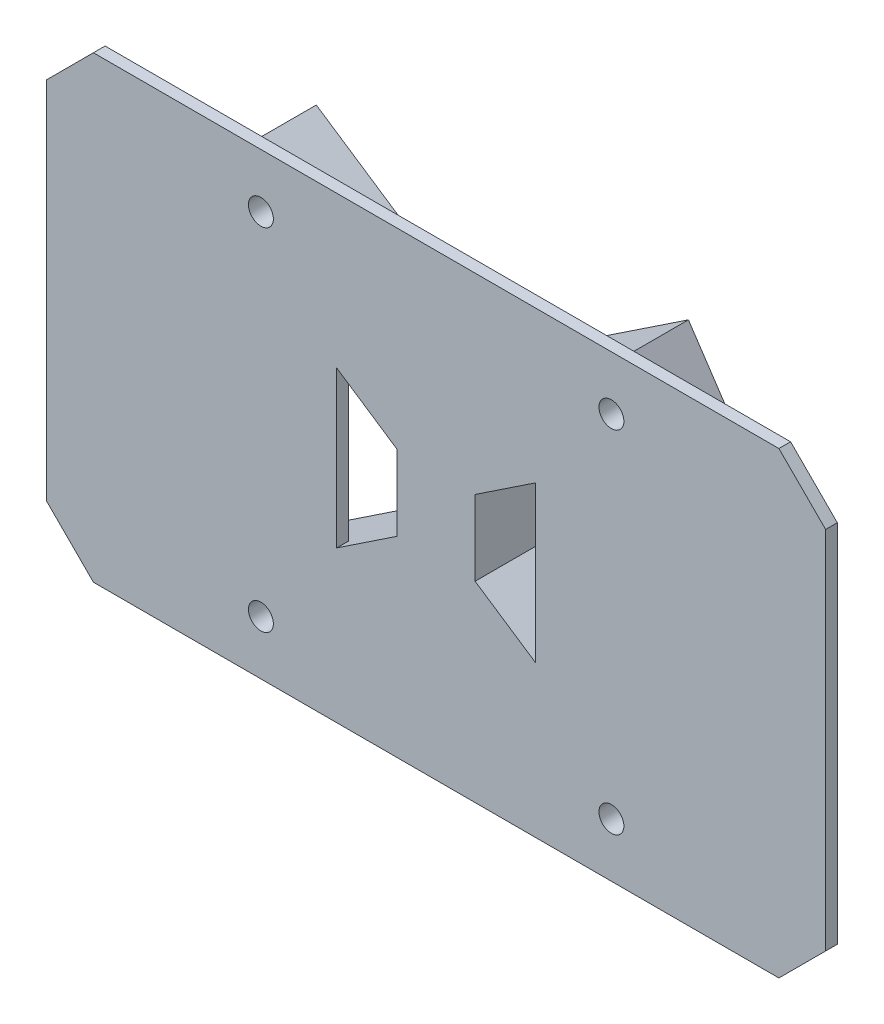
ISO-10303-21;
HEADER;
FILE_DESCRIPTION(('STEP AP214'),'2;1');
FILE_NAME('part.step','',(''),(''),'','','');
FILE_SCHEMA(('AUTOMOTIVE_DESIGN { 1 0 10303 214 1 1 1 1 }'));
ENDSEC;
DATA;
#1=APPLICATION_CONTEXT('core data for automotive mechanical design processes');
#2=APPLICATION_PROTOCOL_DEFINITION('international standard','automotive_design',2000,#1);
#3=PRODUCT_CONTEXT('',#1,'mechanical');
#4=PRODUCT('Part','Part','',(#3));
#5=PRODUCT_RELATED_PRODUCT_CATEGORY('part','',(#4));
#6=PRODUCT_DEFINITION_FORMATION('','',#4);
#7=PRODUCT_DEFINITION_CONTEXT('part definition',#1,'design');
#8=PRODUCT_DEFINITION('design','',#6,#7);
#9=PRODUCT_DEFINITION_SHAPE('','',#8);
#10=(LENGTH_UNIT() NAMED_UNIT(*) SI_UNIT(.MILLI.,.METRE.));
#11=(NAMED_UNIT(*) PLANE_ANGLE_UNIT() SI_UNIT($,.RADIAN.));
#12=(NAMED_UNIT(*) SI_UNIT($,.STERADIAN.) SOLID_ANGLE_UNIT());
#13=UNCERTAINTY_MEASURE_WITH_UNIT(LENGTH_MEASURE(1.E-05),#10,'distance_accuracy_value','');
#14=(GEOMETRIC_REPRESENTATION_CONTEXT(3) GLOBAL_UNCERTAINTY_ASSIGNED_CONTEXT((#13)) GLOBAL_UNIT_ASSIGNED_CONTEXT((#10,
#11,#12)) REPRESENTATION_CONTEXT('',''));
#15=CARTESIAN_POINT('',(0.,0.,0.));
#16=DIRECTION('',(0.,0.,1.));
#17=DIRECTION('',(1.,0.,0.));
#18=AXIS2_PLACEMENT_3D('',#15,#16,#17);
#19=CARTESIAN_POINT('',(5.,0.,7.));
#20=DIRECTION('',(1.,0.,0.));
#21=DIRECTION('',(0.,0.,-1.));
#22=AXIS2_PLACEMENT_3D('',#19,#20,#21);
#23=PLANE('',#22);
#24=DIRECTION('',(0.,-1.,0.));
#25=VECTOR('',#24,1.);
#26=CARTESIAN_POINT('',(5.,0.,0.));
#27=LINE('',#26,#25);
#28=CARTESIAN_POINT('',(5.,4.8240812075602,0.));
#29=VERTEX_POINT('',#28);
#30=CARTESIAN_POINT('',(5.,-4.82408120756012,0.));
#31=VERTEX_POINT('',#30);
#32=EDGE_CURVE('E398',#29,#31,#27,.T.);
#33=ORIENTED_EDGE('',*,*,#32,.F.);
#34=DIRECTION('',(0.,0.,-1.));
#35=VECTOR('',#34,1.);
#36=CARTESIAN_POINT('',(5.,4.8240812075602,7.));
#37=LINE('',#36,#35);
#38=CARTESIAN_POINT('',(5.,4.8240812075602,8.5));
#39=VERTEX_POINT('',#38);
#40=EDGE_CURVE('E491',#39,#29,#37,.T.);
#41=ORIENTED_EDGE('',*,*,#40,.F.);
#42=DIRECTION('',(0.,1.,0.));
#43=VECTOR('',#42,1.);
#44=CARTESIAN_POINT('',(5.,0.,8.5));
#45=LINE('',#44,#43);
#46=CARTESIAN_POINT('',(5.00000000000003,-4.82408120756007,8.5));
#47=VERTEX_POINT('',#46);
#48=EDGE_CURVE('E229',#47,#39,#45,.T.);
#49=ORIENTED_EDGE('',*,*,#48,.F.);
#50=DIRECTION('',(0.,0.,-1.));
#51=VECTOR('',#50,1.);
#52=CARTESIAN_POINT('',(5.,-4.82408120756012,7.));
#53=LINE('',#52,#51);
#54=EDGE_CURVE('E382',#47,#31,#53,.T.);
#55=ORIENTED_EDGE('',*,*,#54,.T.);
#56=EDGE_LOOP('',(#33,#41,#49,#55));
#57=FACE_BOUND('',#56,.T.);
#58=ADVANCED_FACE('F47',(#57),#23,.T.);
#59=CARTESIAN_POINT('',(-0.6880374804123,1.03205622061837,7.));
#60=DIRECTION('',(0.55470019622526,-0.832050294337823,0.));
#61=DIRECTION('',(0.832050294337823,0.55470019622526,0.));
#62=AXIS2_PLACEMENT_3D('',#59,#60,#61);
#63=PLANE('',#62);
#64=DIRECTION('',(-0.832050294337823,-0.55470019622526,0.));
#65=VECTOR('',#64,1.);
#66=CARTESIAN_POINT('',(-0.6880374804123,1.03205622061837,0.));
#67=LINE('',#66,#65);
#68=CARTESIAN_POINT('',(29.4337524528154,21.1132495094369,0.));
#69=VERTEX_POINT('',#68);
#70=EDGE_CURVE('E402',#69,#29,#67,.T.);
#71=ORIENTED_EDGE('',*,*,#70,.F.);
#72=DIRECTION('',(0.,0.,-1.));
#73=VECTOR('',#72,1.);
#74=CARTESIAN_POINT('',(29.4337524528154,21.1132495094369,7.));
#75=LINE('',#74,#73);
#76=CARTESIAN_POINT('',(29.4337524528154,21.1132495094369,7.));
#77=VERTEX_POINT('',#76);
#78=EDGE_CURVE('E488',#77,#69,#75,.T.);
#79=ORIENTED_EDGE('',*,*,#78,.F.);
#80=DIRECTION('',(-0.832050294337823,-0.55470019622526,0.));
#81=VECTOR('',#80,1.);
#82=CARTESIAN_POINT('',(-0.6880374804123,1.03205622061837,7.));
#83=LINE('',#82,#81);
#84=CARTESIAN_POINT('',(12.7638781886591,10.,7.));
#85=VERTEX_POINT('',#84);
#86=EDGE_CURVE('E239',#77,#85,#83,.T.);
#87=ORIENTED_EDGE('',*,*,#86,.T.);
#88=DIRECTION('',(0.,0.,-1.));
#89=VECTOR('',#88,1.);
#90=CARTESIAN_POINT('',(12.7638781886591,10.,8.5));
#91=LINE('',#90,#89);
#92=CARTESIAN_POINT('',(12.7638781886591,10.,8.5));
#93=VERTEX_POINT('',#92);
#94=EDGE_CURVE('E235',#93,#85,#91,.T.);
#95=ORIENTED_EDGE('',*,*,#94,.F.);
#96=DIRECTION('',(0.832050294337823,0.55470019622526,0.));
#97=VECTOR('',#96,1.);
#98=CARTESIAN_POINT('',(-0.6880374804123,1.03205622061837,8.5));
#99=LINE('',#98,#97);
#100=EDGE_CURVE('E221',#39,#93,#99,.T.);
#101=ORIENTED_EDGE('',*,*,#100,.F.);
#102=ORIENTED_EDGE('',*,*,#40,.T.);
#103=EDGE_LOOP('',(#71,#79,#87,#95,#101,#102));
#104=FACE_BOUND('',#103,.T.);
#105=ADVANCED_FACE('F237',(#104),#63,.T.);
#106=CARTESIAN_POINT('',(30.1217899332277,20.0811932888185,7.));
#107=DIRECTION('',(-0.832050294337843,-0.55470019622523,0.));
#108=DIRECTION('',(0.55470019622523,-0.832050294337843,0.));
#109=AXIS2_PLACEMENT_3D('',#106,#107,#108);
#110=PLANE('',#109);
#111=DIRECTION('',(-0.55470019622523,0.832050294337843,0.));
#112=VECTOR('',#111,1.);
#113=CARTESIAN_POINT('',(30.1217899332277,20.0811932888185,0.));
#114=LINE('',#113,#112);
#115=CARTESIAN_POINT('',(23.8867504905631,29.4337524528154,0.));
#116=VERTEX_POINT('',#115);
#117=EDGE_CURVE('E406',#69,#116,#114,.T.);
#118=ORIENTED_EDGE('',*,*,#117,.T.);
#119=DIRECTION('',(0.,0.,-1.));
#120=VECTOR('',#119,1.);
#121=CARTESIAN_POINT('',(23.8867504905631,29.4337524528154,7.));
#122=LINE('',#121,#120);
#123=CARTESIAN_POINT('',(23.886750490563,29.4337524528154,7.));
#124=VERTEX_POINT('',#123);
#125=EDGE_CURVE('E485',#124,#116,#122,.T.);
#126=ORIENTED_EDGE('',*,*,#125,.F.);
#127=DIRECTION('',(-0.55470019622523,0.832050294337843,0.));
#128=VECTOR('',#127,1.);
#129=CARTESIAN_POINT('',(30.1217899332277,20.0811932888185,7.));
#130=LINE('',#129,#128);
#131=EDGE_CURVE('E338',#77,#124,#130,.T.);
#132=ORIENTED_EDGE('',*,*,#131,.F.);
#133=ORIENTED_EDGE('',*,*,#78,.T.);
#134=EDGE_LOOP('',(#118,#126,#132,#133));
#135=FACE_BOUND('',#134,.T.);
#136=ADVANCED_FACE('F590',(#135),#110,.F.);
#137=CARTESIAN_POINT('',(-6.23503944266461,9.35255916399688,7.));
#138=DIRECTION('',(-0.55470019622523,0.832050294337843,0.));
#139=DIRECTION('',(-0.832050294337843,-0.55470019622523,0.));
#140=AXIS2_PLACEMENT_3D('',#137,#138,#139);
#141=PLANE('',#140);
#142=DIRECTION('',(0.832050294337843,0.55470019622523,0.));
#143=VECTOR('',#142,1.);
#144=CARTESIAN_POINT('',(-6.23503944266461,9.35255916399688,0.));
#145=LINE('',#144,#143);
#146=CARTESIAN_POINT('',(-1.20563281580388E-13,13.5092521257734,0.));
#147=VERTEX_POINT('',#146);
#148=EDGE_CURVE('E410',#147,#116,#145,.T.);
#149=ORIENTED_EDGE('',*,*,#148,.F.);
#150=DIRECTION('',(0.,0.,-1.));
#151=VECTOR('',#150,1.);
#152=CARTESIAN_POINT('',(-1.20563281580388E-13,13.5092521257734,7.));
#153=LINE('',#152,#151);
#154=CARTESIAN_POINT('',(-1.20563281580388E-13,13.5092521257734,7.));
#155=VERTEX_POINT('',#154);
#156=EDGE_CURVE('E482',#155,#147,#153,.T.);
#157=ORIENTED_EDGE('',*,*,#156,.F.);
#158=DIRECTION('',(0.832050294337843,0.55470019622523,0.));
#159=VECTOR('',#158,1.);
#160=CARTESIAN_POINT('',(-6.23503944266461,9.35255916399688,7.));
#161=LINE('',#160,#159);
#162=EDGE_CURVE('E342',#155,#124,#161,.T.);
#163=ORIENTED_EDGE('',*,*,#162,.T.);
#164=ORIENTED_EDGE('',*,*,#125,.T.);
#165=EDGE_LOOP('',(#149,#157,#163,#164));
#166=FACE_BOUND('',#165,.T.);
#167=ADVANCED_FACE('F886',(#166),#141,.T.);
#168=CARTESIAN_POINT('',(6.23503944266461,9.35255916399691,7.));
#169=DIRECTION('',(0.554700196225229,0.832050294337844,0.));
#170=DIRECTION('',(-0.832050294337844,0.554700196225229,0.));
#171=AXIS2_PLACEMENT_3D('',#168,#169,#170);
#172=PLANE('',#171);
#173=DIRECTION('',(0.832050294337844,-0.554700196225229,0.));
#174=VECTOR('',#173,1.);
#175=CARTESIAN_POINT('',(6.23503944266461,9.35255916399691,0.));
#176=LINE('',#175,#174);
#177=CARTESIAN_POINT('',(-23.8867504905631,29.4337524528154,0.));
#178=VERTEX_POINT('',#177);
#179=EDGE_CURVE('E414',#178,#147,#176,.T.);
#180=ORIENTED_EDGE('',*,*,#179,.F.);
#181=DIRECTION('',(0.,0.,-1.));
#182=VECTOR('',#181,1.);
#183=CARTESIAN_POINT('',(-23.8867504905631,29.4337524528154,7.));
#184=LINE('',#183,#182);
#185=CARTESIAN_POINT('',(-23.8867504905631,29.4337524528154,7.));
#186=VERTEX_POINT('',#185);
#187=EDGE_CURVE('E479',#186,#178,#184,.T.);
#188=ORIENTED_EDGE('',*,*,#187,.F.);
#189=DIRECTION('',(0.832050294337844,-0.554700196225229,0.));
#190=VECTOR('',#189,1.);
#191=CARTESIAN_POINT('',(6.23503944266461,9.35255916399691,7.));
#192=LINE('',#191,#190);
#193=EDGE_CURVE('E346',#186,#155,#192,.T.);
#194=ORIENTED_EDGE('',*,*,#193,.T.);
#195=ORIENTED_EDGE('',*,*,#156,.T.);
#196=EDGE_LOOP('',(#180,#188,#194,#195));
#197=FACE_BOUND('',#196,.T.);
#198=ADVANCED_FACE('F875',(#197),#172,.T.);
#199=CARTESIAN_POINT('',(-30.1217899332277,20.0811932888185,7.));
#200=DIRECTION('',(-0.832050294337843,0.55470019622523,0.));
#201=DIRECTION('',(-0.55470019622523,-0.832050294337843,0.));
#202=AXIS2_PLACEMENT_3D('',#199,#200,#201);
#203=PLANE('',#202);
#204=DIRECTION('',(0.55470019622523,0.832050294337843,0.));
#205=VECTOR('',#204,1.);
#206=CARTESIAN_POINT('',(-30.1217899332277,20.0811932888185,0.));
#207=LINE('',#206,#205);
#208=CARTESIAN_POINT('',(-29.4337524528154,21.1132495094369,0.));
#209=VERTEX_POINT('',#208);
#210=EDGE_CURVE('E418',#209,#178,#207,.T.);
#211=ORIENTED_EDGE('',*,*,#210,.F.);
#212=DIRECTION('',(0.,0.,-1.));
#213=VECTOR('',#212,1.);
#214=CARTESIAN_POINT('',(-29.4337524528154,21.1132495094369,7.));
#215=LINE('',#214,#213);
#216=CARTESIAN_POINT('',(-29.4337524528154,21.1132495094369,7.));
#217=VERTEX_POINT('',#216);
#218=EDGE_CURVE('E476',#217,#209,#215,.T.);
#219=ORIENTED_EDGE('',*,*,#218,.F.);
#220=DIRECTION('',(0.55470019622523,0.832050294337843,0.));
#221=VECTOR('',#220,1.);
#222=CARTESIAN_POINT('',(-30.1217899332277,20.0811932888185,7.));
#223=LINE('',#222,#221);
#224=EDGE_CURVE('E350',#217,#186,#223,.T.);
#225=ORIENTED_EDGE('',*,*,#224,.T.);
#226=ORIENTED_EDGE('',*,*,#187,.T.);
#227=EDGE_LOOP('',(#211,#219,#225,#226));
#228=FACE_BOUND('',#227,.T.);
#229=ADVANCED_FACE('F866',(#228),#203,.T.);
#230=CARTESIAN_POINT('',(0.688037480412318,1.03205622061848,7.));
#231=DIRECTION('',(-0.554700196225229,-0.832050294337844,0.));
#232=DIRECTION('',(0.832050294337844,-0.554700196225229,0.));
#233=AXIS2_PLACEMENT_3D('',#230,#231,#232);
#234=PLANE('',#233);
#235=DIRECTION('',(-0.832050294337844,0.554700196225229,0.));
#236=VECTOR('',#235,1.);
#237=CARTESIAN_POINT('',(0.688037480412318,1.03205622061848,0.));
#238=LINE('',#237,#236);
#239=CARTESIAN_POINT('',(-5.,4.82408120756002,0.));
#240=VERTEX_POINT('',#239);
#241=EDGE_CURVE('E422',#240,#209,#238,.T.);
#242=ORIENTED_EDGE('',*,*,#241,.F.);
#243=DIRECTION('',(0.,0.,-1.));
#244=VECTOR('',#243,1.);
#245=CARTESIAN_POINT('',(-5.,4.82408120756002,7.));
#246=LINE('',#245,#244);
#247=CARTESIAN_POINT('',(-5.,4.82408120756002,8.5));
#248=VERTEX_POINT('',#247);
#249=EDGE_CURVE('E473',#248,#240,#246,.T.);
#250=ORIENTED_EDGE('',*,*,#249,.F.);
#251=DIRECTION('',(0.832050294337844,-0.554700196225229,0.));
#252=VECTOR('',#251,1.);
#253=CARTESIAN_POINT('',(0.688037480412319,1.03205622061848,8.5));
#254=LINE('',#253,#252);
#255=CARTESIAN_POINT('',(-12.7638781886598,9.99999999999986,8.5));
#256=VERTEX_POINT('',#255);
#257=EDGE_CURVE('E262',#256,#248,#254,.T.);
#258=ORIENTED_EDGE('',*,*,#257,.F.);
#259=DIRECTION('',(0.,0.,-1.));
#260=VECTOR('',#259,1.);
#261=CARTESIAN_POINT('',(-12.7638781886598,9.99999999999986,8.5));
#262=LINE('',#261,#260);
#263=CARTESIAN_POINT('',(-12.7638781886598,9.99999999999986,7.));
#264=VERTEX_POINT('',#263);
#265=EDGE_CURVE('E329',#256,#264,#262,.T.);
#266=ORIENTED_EDGE('',*,*,#265,.T.);
#267=DIRECTION('',(-0.832050294337844,0.554700196225229,0.));
#268=VECTOR('',#267,1.);
#269=CARTESIAN_POINT('',(0.688037480412318,1.03205622061848,7.));
#270=LINE('',#269,#268);
#271=EDGE_CURVE('E354',#264,#217,#270,.T.);
#272=ORIENTED_EDGE('',*,*,#271,.T.);
#273=ORIENTED_EDGE('',*,*,#218,.T.);
#274=EDGE_LOOP('',(#242,#250,#258,#266,#272,#273));
#275=FACE_BOUND('',#274,.T.);
#276=ADVANCED_FACE('F855',(#275),#234,.T.);
#277=CARTESIAN_POINT('',(-5.00000000000001,0.,7.));
#278=DIRECTION('',(1.,0.,0.));
#279=DIRECTION('',(0.,1.,0.));
#280=AXIS2_PLACEMENT_3D('',#277,#278,#279);
#281=PLANE('',#280);
#282=DIRECTION('',(0.,-1.,0.));
#283=VECTOR('',#282,1.);
#284=CARTESIAN_POINT('',(-5.00000000000001,0.,0.));
#285=LINE('',#284,#283);
#286=CARTESIAN_POINT('',(-5.00000000000001,-4.82408120756004,0.));
#287=VERTEX_POINT('',#286);
#288=EDGE_CURVE('E426',#240,#287,#285,.T.);
#289=ORIENTED_EDGE('',*,*,#288,.T.);
#290=DIRECTION('',(0.,0.,-1.));
#291=VECTOR('',#290,1.);
#292=CARTESIAN_POINT('',(-5.00000000000001,-4.82408120756004,7.));
#293=LINE('',#292,#291);
#294=CARTESIAN_POINT('',(-5.00000000000001,-4.82408120756004,8.5));
#295=VERTEX_POINT('',#294);
#296=EDGE_CURVE('E470',#295,#287,#293,.T.);
#297=ORIENTED_EDGE('',*,*,#296,.F.);
#298=DIRECTION('',(0.,-1.,0.));
#299=VECTOR('',#298,1.);
#300=CARTESIAN_POINT('',(-5.00000000000001,0.,8.5));
#301=LINE('',#300,#299);
#302=EDGE_CURVE('E266',#248,#295,#301,.T.);
#303=ORIENTED_EDGE('',*,*,#302,.F.);
#304=ORIENTED_EDGE('',*,*,#249,.T.);
#305=EDGE_LOOP('',(#289,#297,#303,#304));
#306=FACE_BOUND('',#305,.T.);
#307=ADVANCED_FACE('F846',(#306),#281,.F.);
#308=CARTESIAN_POINT('',(0.68803748041232,-1.03205622061848,7.));
#309=DIRECTION('',(-0.55470019622523,0.832050294337843,0.));
#310=DIRECTION('',(-0.832050294337843,-0.55470019622523,0.));
#311=AXIS2_PLACEMENT_3D('',#308,#309,#310);
#312=PLANE('',#311);
#313=DIRECTION('',(0.832050294337843,0.55470019622523,0.));
#314=VECTOR('',#313,1.);
#315=CARTESIAN_POINT('',(0.68803748041232,-1.03205622061848,0.));
#316=LINE('',#315,#314);
#317=CARTESIAN_POINT('',(-29.4337524528154,-21.113249509437,0.));
#318=VERTEX_POINT('',#317);
#319=EDGE_CURVE('E430',#318,#287,#316,.T.);
#320=ORIENTED_EDGE('',*,*,#319,.F.);
#321=DIRECTION('',(0.,0.,-1.));
#322=VECTOR('',#321,1.);
#323=CARTESIAN_POINT('',(-29.4337524528154,-21.113249509437,7.));
#324=LINE('',#323,#322);
#325=CARTESIAN_POINT('',(-29.4337524528154,-21.113249509437,7.));
#326=VERTEX_POINT('',#325);
#327=EDGE_CURVE('E467',#326,#318,#324,.T.);
#328=ORIENTED_EDGE('',*,*,#327,.F.);
#329=DIRECTION('',(0.832050294337843,0.55470019622523,0.));
#330=VECTOR('',#329,1.);
#331=CARTESIAN_POINT('',(0.68803748041232,-1.03205622061848,7.));
#332=LINE('',#331,#330);
#333=CARTESIAN_POINT('',(-12.7638781886599,-10.,7.));
#334=VERTEX_POINT('',#333);
#335=EDGE_CURVE('E358',#326,#334,#332,.T.);
#336=ORIENTED_EDGE('',*,*,#335,.T.);
#337=DIRECTION('',(0.,0.,-1.));
#338=VECTOR('',#337,1.);
#339=CARTESIAN_POINT('',(-12.7638781886599,-10.,8.5));
#340=LINE('',#339,#338);
#341=CARTESIAN_POINT('',(-12.7638781886599,-10.,8.5));
#342=VERTEX_POINT('',#341);
#343=EDGE_CURVE('E244',#342,#334,#340,.T.);
#344=ORIENTED_EDGE('',*,*,#343,.F.);
#345=DIRECTION('',(-0.832050294337843,-0.55470019622523,0.));
#346=VECTOR('',#345,1.);
#347=CARTESIAN_POINT('',(0.68803748041232,-1.03205622061848,8.5));
#348=LINE('',#347,#346);
#349=EDGE_CURVE('E270',#295,#342,#348,.T.);
#350=ORIENTED_EDGE('',*,*,#349,.F.);
#351=ORIENTED_EDGE('',*,*,#296,.T.);
#352=EDGE_LOOP('',(#320,#328,#336,#344,#350,#351));
#353=FACE_BOUND('',#352,.T.);
#354=ADVANCED_FACE('F835',(#353),#312,.T.);
#355=CARTESIAN_POINT('',(-30.1217899332277,-20.0811932888185,7.));
#356=DIRECTION('',(0.832050294337843,0.55470019622523,0.));
#357=DIRECTION('',(-0.55470019622523,0.832050294337843,0.));
#358=AXIS2_PLACEMENT_3D('',#355,#356,#357);
#359=PLANE('',#358);
#360=DIRECTION('',(0.55470019622523,-0.832050294337843,0.));
#361=VECTOR('',#360,1.);
#362=CARTESIAN_POINT('',(-30.1217899332277,-20.0811932888185,0.));
#363=LINE('',#362,#361);
#364=CARTESIAN_POINT('',(-23.886750490563,-29.4337524528154,0.));
#365=VERTEX_POINT('',#364);
#366=EDGE_CURVE('E434',#318,#365,#363,.T.);
#367=ORIENTED_EDGE('',*,*,#366,.T.);
#368=DIRECTION('',(0.,0.,-1.));
#369=VECTOR('',#368,1.);
#370=CARTESIAN_POINT('',(-23.886750490563,-29.4337524528154,7.));
#371=LINE('',#370,#369);
#372=CARTESIAN_POINT('',(-23.886750490563,-29.4337524528154,7.));
#373=VERTEX_POINT('',#372);
#374=EDGE_CURVE('E464',#373,#365,#371,.T.);
#375=ORIENTED_EDGE('',*,*,#374,.F.);
#376=DIRECTION('',(0.55470019622523,-0.832050294337843,0.));
#377=VECTOR('',#376,1.);
#378=CARTESIAN_POINT('',(-30.1217899332277,-20.0811932888185,7.));
#379=LINE('',#378,#377);
#380=EDGE_CURVE('E362',#326,#373,#379,.T.);
#381=ORIENTED_EDGE('',*,*,#380,.F.);
#382=ORIENTED_EDGE('',*,*,#327,.T.);
#383=EDGE_LOOP('',(#367,#375,#381,#382));
#384=FACE_BOUND('',#383,.T.);
#385=ADVANCED_FACE('F826',(#384),#359,.F.);
#386=CARTESIAN_POINT('',(6.23503944266461,-9.35255916399687,7.));
#387=DIRECTION('',(0.554700196225231,-0.832050294337843,0.));
#388=DIRECTION('',(0.832050294337843,0.554700196225231,0.));
#389=AXIS2_PLACEMENT_3D('',#386,#387,#388);
#390=PLANE('',#389);
#391=DIRECTION('',(-0.832050294337843,-0.554700196225231,0.));
#392=VECTOR('',#391,1.);
#393=CARTESIAN_POINT('',(6.23503944266461,-9.35255916399687,0.));
#394=LINE('',#393,#392);
#395=CARTESIAN_POINT('',(-1.11022302462516E-13,-13.5092521257734,0.));
#396=VERTEX_POINT('',#395);
#397=EDGE_CURVE('E438',#396,#365,#394,.T.);
#398=ORIENTED_EDGE('',*,*,#397,.F.);
#399=DIRECTION('',(0.,0.,-1.));
#400=VECTOR('',#399,1.);
#401=CARTESIAN_POINT('',(-1.11022302462516E-13,-13.5092521257734,7.));
#402=LINE('',#401,#400);
#403=CARTESIAN_POINT('',(-1.11022302462516E-13,-13.5092521257734,7.));
#404=VERTEX_POINT('',#403);
#405=EDGE_CURVE('E461',#404,#396,#402,.T.);
#406=ORIENTED_EDGE('',*,*,#405,.F.);
#407=DIRECTION('',(-0.832050294337843,-0.554700196225231,0.));
#408=VECTOR('',#407,1.);
#409=CARTESIAN_POINT('',(6.23503944266461,-9.35255916399687,7.));
#410=LINE('',#409,#408);
#411=EDGE_CURVE('E366',#404,#373,#410,.T.);
#412=ORIENTED_EDGE('',*,*,#411,.T.);
#413=ORIENTED_EDGE('',*,*,#374,.T.);
#414=EDGE_LOOP('',(#398,#406,#412,#413));
#415=FACE_BOUND('',#414,.T.);
#416=ADVANCED_FACE('F816',(#415),#390,.T.);
#417=CARTESIAN_POINT('',(-6.23503944266488,-9.35255916399653,7.));
#418=DIRECTION('',(-0.554700196225262,-0.832050294337822,0.));
#419=DIRECTION('',(0.832050294337822,-0.554700196225262,0.));
#420=AXIS2_PLACEMENT_3D('',#417,#418,#419);
#421=PLANE('',#420);
#422=DIRECTION('',(-0.832050294337822,0.554700196225262,0.));
#423=VECTOR('',#422,1.);
#424=CARTESIAN_POINT('',(-6.23503944266488,-9.35255916399653,0.));
#425=LINE('',#424,#423);
#426=CARTESIAN_POINT('',(23.8867504905631,-29.4337524528154,0.));
#427=VERTEX_POINT('',#426);
#428=EDGE_CURVE('E442',#427,#396,#425,.T.);
#429=ORIENTED_EDGE('',*,*,#428,.F.);
#430=DIRECTION('',(0.,0.,-1.));
#431=VECTOR('',#430,1.);
#432=CARTESIAN_POINT('',(23.8867504905631,-29.4337524528154,7.));
#433=LINE('',#432,#431);
#434=CARTESIAN_POINT('',(23.8867504905631,-29.4337524528154,7.));
#435=VERTEX_POINT('',#434);
#436=EDGE_CURVE('E458',#435,#427,#433,.T.);
#437=ORIENTED_EDGE('',*,*,#436,.F.);
#438=DIRECTION('',(-0.832050294337822,0.554700196225262,0.));
#439=VECTOR('',#438,1.);
#440=CARTESIAN_POINT('',(-6.23503944266488,-9.35255916399653,7.));
#441=LINE('',#440,#439);
#442=EDGE_CURVE('E370',#435,#404,#441,.T.);
#443=ORIENTED_EDGE('',*,*,#442,.T.);
#444=ORIENTED_EDGE('',*,*,#405,.T.);
#445=EDGE_LOOP('',(#429,#437,#443,#444));
#446=FACE_BOUND('',#445,.T.);
#447=ADVANCED_FACE('F805',(#446),#421,.T.);
#448=CARTESIAN_POINT('',(30.1217899332277,-20.0811932888185,7.));
#449=DIRECTION('',(0.832050294337843,-0.554700196225229,0.));
#450=DIRECTION('',(0.554700196225229,0.832050294337843,0.));
#451=AXIS2_PLACEMENT_3D('',#448,#449,#450);
#452=PLANE('',#451);
#453=DIRECTION('',(-0.554700196225229,-0.832050294337843,0.));
#454=VECTOR('',#453,1.);
#455=CARTESIAN_POINT('',(30.1217899332277,-20.0811932888185,0.));
#456=LINE('',#455,#454);
#457=CARTESIAN_POINT('',(29.4337524528154,-21.1132495094369,0.));
#458=VERTEX_POINT('',#457);
#459=EDGE_CURVE('E446',#458,#427,#456,.T.);
#460=ORIENTED_EDGE('',*,*,#459,.F.);
#461=DIRECTION('',(0.,0.,-1.));
#462=VECTOR('',#461,1.);
#463=CARTESIAN_POINT('',(29.4337524528154,-21.1132495094369,7.));
#464=LINE('',#463,#462);
#465=CARTESIAN_POINT('',(29.4337524528154,-21.1132495094369,7.));
#466=VERTEX_POINT('',#465);
#467=EDGE_CURVE('E455',#466,#458,#464,.T.);
#468=ORIENTED_EDGE('',*,*,#467,.F.);
#469=DIRECTION('',(-0.554700196225229,-0.832050294337843,0.));
#470=VECTOR('',#469,1.);
#471=CARTESIAN_POINT('',(30.1217899332277,-20.0811932888185,7.));
#472=LINE('',#471,#470);
#473=EDGE_CURVE('E374',#466,#435,#472,.T.);
#474=ORIENTED_EDGE('',*,*,#473,.T.);
#475=ORIENTED_EDGE('',*,*,#436,.T.);
#476=EDGE_LOOP('',(#460,#468,#474,#475));
#477=FACE_BOUND('',#476,.T.);
#478=ADVANCED_FACE('F599',(#477),#452,.T.);
#479=CARTESIAN_POINT('',(-22.5,22.5,7.));
#480=DIRECTION('',(0.,0.,-1.));
#481=DIRECTION('',(-1.,0.,0.));
#482=AXIS2_PLACEMENT_3D('',#479,#480,#481);
#483=CYLINDRICAL_SURFACE('',#482,1.6);
#484=CARTESIAN_POINT('',(-22.5,22.5,0.));
#485=DIRECTION('',(0.,0.,1.));
#486=DIRECTION('',(1.,0.,0.));
#487=AXIS2_PLACEMENT_3D('',#484,#485,#486);
#488=CIRCLE('',#487,1.6);
#489=CARTESIAN_POINT('',(-20.9,22.5,0.));
#490=VERTEX_POINT('',#489);
#491=EDGE_CURVE('E394',#490,#490,#488,.T.);
#492=ORIENTED_EDGE('',*,*,#491,.F.);
#493=EDGE_LOOP('',(#492));
#494=FACE_BOUND('',#493,.T.);
#495=CARTESIAN_POINT('',(-22.5,22.5,8.5));
#496=DIRECTION('',(0.,0.,1.));
#497=DIRECTION('',(1.,0.,0.));
#498=AXIS2_PLACEMENT_3D('',#495,#496,#497);
#499=CIRCLE('',#498,1.6);
#500=CARTESIAN_POINT('',(-20.9,22.5,8.5));
#501=VERTEX_POINT('',#500);
#502=EDGE_CURVE('E300',#501,#501,#499,.F.);
#503=ORIENTED_EDGE('',*,*,#502,.F.);
#504=EDGE_LOOP('',(#503));
#505=FACE_BOUND('',#504,.T.);
#506=ADVANCED_FACE('F595',(#494,#505),#483,.F.);
#507=CARTESIAN_POINT('',(22.5,22.5000000000013,7.));
#508=DIRECTION('',(0.,0.,-1.));
#509=DIRECTION('',(-1.,0.,0.));
#510=AXIS2_PLACEMENT_3D('',#507,#508,#509);
#511=CYLINDRICAL_SURFACE('',#510,1.60000000000132);
#512=CARTESIAN_POINT('',(22.5,22.5000000000013,0.));
#513=DIRECTION('',(0.,0.,1.));
#514=DIRECTION('',(1.,0.,0.));
#515=AXIS2_PLACEMENT_3D('',#512,#513,#514);
#516=CIRCLE('',#515,1.60000000000132);
#517=CARTESIAN_POINT('',(24.1000000000013,22.5000000000013,0.));
#518=VERTEX_POINT('',#517);
#519=EDGE_CURVE('E390',#518,#518,#516,.T.);
#520=ORIENTED_EDGE('',*,*,#519,.F.);
#521=EDGE_LOOP('',(#520));
#522=FACE_BOUND('',#521,.T.);
#523=CARTESIAN_POINT('',(22.5,22.5000000000013,8.5));
#524=DIRECTION('',(0.,0.,1.));
#525=DIRECTION('',(1.,0.,0.));
#526=AXIS2_PLACEMENT_3D('',#523,#524,#525);
#527=CIRCLE('',#526,1.60000000000132);
#528=CARTESIAN_POINT('',(24.1000000000013,22.5000000000013,8.5));
#529=VERTEX_POINT('',#528);
#530=EDGE_CURVE('E296',#529,#529,#527,.F.);
#531=ORIENTED_EDGE('',*,*,#530,.F.);
#532=EDGE_LOOP('',(#531));
#533=FACE_BOUND('',#532,.T.);
#534=ADVANCED_FACE('F598',(#522,#533),#511,.F.);
#535=CARTESIAN_POINT('',(22.5000000000013,-22.4999999999987,7.));
#536=DIRECTION('',(0.,0.,-1.));
#537=DIRECTION('',(-1.,0.,0.));
#538=AXIS2_PLACEMENT_3D('',#535,#536,#537);
#539=CYLINDRICAL_SURFACE('',#538,1.6000000000018);
#540=CARTESIAN_POINT('',(22.5000000000013,-22.4999999999987,0.));
#541=DIRECTION('',(0.,0.,1.));
#542=DIRECTION('',(1.,0.,0.));
#543=AXIS2_PLACEMENT_3D('',#540,#541,#542);
#544=CIRCLE('',#543,1.6000000000018);
#545=CARTESIAN_POINT('',(24.1000000000031,-22.4999999999987,0.));
#546=VERTEX_POINT('',#545);
#547=EDGE_CURVE('E386',#546,#546,#544,.T.);
#548=ORIENTED_EDGE('',*,*,#547,.F.);
#549=EDGE_LOOP('',(#548));
#550=FACE_BOUND('',#549,.T.);
#551=CARTESIAN_POINT('',(22.5000000000013,-22.4999999999987,8.5));
#552=DIRECTION('',(0.,0.,1.));
#553=DIRECTION('',(1.,0.,0.));
#554=AXIS2_PLACEMENT_3D('',#551,#552,#553);
#555=CIRCLE('',#554,1.6000000000018);
#556=CARTESIAN_POINT('',(24.1000000000031,-22.4999999999987,8.5));
#557=VERTEX_POINT('',#556);
#558=EDGE_CURVE('E288',#557,#557,#555,.F.);
#559=ORIENTED_EDGE('',*,*,#558,.F.);
#560=EDGE_LOOP('',(#559));
#561=FACE_BOUND('',#560,.T.);
#562=ADVANCED_FACE('F603',(#550,#561),#539,.F.);
#563=CARTESIAN_POINT('',(-22.4999999999987,-22.5,7.));
#564=DIRECTION('',(0.,0.,-1.));
#565=DIRECTION('',(-1.,0.,0.));
#566=AXIS2_PLACEMENT_3D('',#563,#564,#565);
#567=CYLINDRICAL_SURFACE('',#566,1.60000000000068);
#568=CARTESIAN_POINT('',(-22.4999999999987,-22.5,0.));
#569=DIRECTION('',(0.,0.,1.));
#570=DIRECTION('',(1.,0.,0.));
#571=AXIS2_PLACEMENT_3D('',#568,#569,#570);
#572=CIRCLE('',#571,1.60000000000068);
#573=CARTESIAN_POINT('',(-20.8999999999981,-22.5,0.));
#574=VERTEX_POINT('',#573);
#575=EDGE_CURVE('E333',#574,#574,#572,.T.);
#576=ORIENTED_EDGE('',*,*,#575,.F.);
#577=EDGE_LOOP('',(#576));
#578=FACE_BOUND('',#577,.T.);
#579=CARTESIAN_POINT('',(-22.4999999999987,-22.5,8.5));
#580=DIRECTION('',(0.,0.,1.));
#581=DIRECTION('',(1.,0.,0.));
#582=AXIS2_PLACEMENT_3D('',#579,#580,#581);
#583=CIRCLE('',#582,1.60000000000068);
#584=CARTESIAN_POINT('',(-20.8999999999981,-22.5,8.5));
#585=VERTEX_POINT('',#584);
#586=EDGE_CURVE('E292',#585,#585,#583,.F.);
#587=ORIENTED_EDGE('',*,*,#586,.F.);
#588=EDGE_LOOP('',(#587));
#589=FACE_BOUND('',#588,.T.);
#590=ADVANCED_FACE('F607',(#578,#589),#567,.F.);
#591=CARTESIAN_POINT('',(-0.688037480412335,-1.0320562206185,7.));
#592=DIRECTION('',(0.554700196225228,0.832050294337844,0.));
#593=DIRECTION('',(-0.832050294337844,0.554700196225228,0.));
#594=AXIS2_PLACEMENT_3D('',#591,#592,#593);
#595=PLANE('',#594);
#596=DIRECTION('',(0.832050294337844,-0.554700196225228,0.));
#597=VECTOR('',#596,1.);
#598=CARTESIAN_POINT('',(-0.688037480412335,-1.0320562206185,0.));
#599=LINE('',#598,#597);
#600=EDGE_CURVE('E339',#31,#458,#599,.T.);
#601=ORIENTED_EDGE('',*,*,#600,.F.);
#602=ORIENTED_EDGE('',*,*,#54,.F.);
#603=DIRECTION('',(-0.832050294337844,0.554700196225228,0.));
#604=VECTOR('',#603,1.);
#605=CARTESIAN_POINT('',(-0.688037480412335,-1.0320562206185,8.5));
#606=LINE('',#605,#604);
#607=CARTESIAN_POINT('',(12.7638781886599,-10.,8.5));
#608=VERTEX_POINT('',#607);
#609=EDGE_CURVE('E251',#608,#47,#606,.T.);
#610=ORIENTED_EDGE('',*,*,#609,.F.);
#611=DIRECTION('',(0.,0.,-1.));
#612=VECTOR('',#611,1.);
#613=CARTESIAN_POINT('',(12.7638781886599,-10.,8.5));
#614=LINE('',#613,#612);
#615=CARTESIAN_POINT('',(12.7638781886599,-10.,7.));
#616=VERTEX_POINT('',#615);
#617=EDGE_CURVE('E245',#608,#616,#614,.T.);
#618=ORIENTED_EDGE('',*,*,#617,.T.);
#619=DIRECTION('',(0.832050294337844,-0.554700196225228,0.));
#620=VECTOR('',#619,1.);
#621=CARTESIAN_POINT('',(-0.688037480412335,-1.0320562206185,7.));
#622=LINE('',#621,#620);
#623=EDGE_CURVE('E378',#616,#466,#622,.T.);
#624=ORIENTED_EDGE('',*,*,#623,.T.);
#625=ORIENTED_EDGE('',*,*,#467,.T.);
#626=EDGE_LOOP('',(#601,#602,#610,#618,#624,#625));
#627=FACE_BOUND('',#626,.T.);
#628=ADVANCED_FACE('F611',(#627),#595,.T.);
#629=CARTESIAN_POINT('',(0.,0.,0.));
#630=DIRECTION('',(0.,0.,1.));
#631=DIRECTION('',(1.,0.,0.));
#632=AXIS2_PLACEMENT_3D('',#629,#630,#631);
#633=PLANE('',#632);
#634=ORIENTED_EDGE('',*,*,#575,.T.);
#635=EDGE_LOOP('',(#634));
#636=FACE_BOUND('',#635,.T.);
#637=ORIENTED_EDGE('',*,*,#547,.T.);
#638=EDGE_LOOP('',(#637));
#639=FACE_BOUND('',#638,.T.);
#640=ORIENTED_EDGE('',*,*,#519,.T.);
#641=EDGE_LOOP('',(#640));
#642=FACE_BOUND('',#641,.T.);
#643=ORIENTED_EDGE('',*,*,#491,.T.);
#644=EDGE_LOOP('',(#643));
#645=FACE_BOUND('',#644,.T.);
#646=ORIENTED_EDGE('',*,*,#32,.T.);
#647=ORIENTED_EDGE('',*,*,#600,.T.);
#648=ORIENTED_EDGE('',*,*,#459,.T.);
#649=ORIENTED_EDGE('',*,*,#428,.T.);
#650=ORIENTED_EDGE('',*,*,#397,.T.);
#651=ORIENTED_EDGE('',*,*,#366,.F.);
#652=ORIENTED_EDGE('',*,*,#319,.T.);
#653=ORIENTED_EDGE('',*,*,#288,.F.);
#654=ORIENTED_EDGE('',*,*,#241,.T.);
#655=ORIENTED_EDGE('',*,*,#210,.T.);
#656=ORIENTED_EDGE('',*,*,#179,.T.);
#657=ORIENTED_EDGE('',*,*,#148,.T.);
#658=ORIENTED_EDGE('',*,*,#117,.F.);
#659=ORIENTED_EDGE('',*,*,#70,.T.);
#660=EDGE_LOOP('',(#646,#647,#648,#649,#650,#651,#652,#653,#654,#655,#656,#657,#658,#659));
#661=FACE_BOUND('',#660,.T.);
#662=ADVANCED_FACE('F752',(#636,#639,#642,#645,#661),#633,.F.);
#663=CARTESIAN_POINT('',(0.,0.,7.));
#664=DIRECTION('',(0.,0.,1.));
#665=DIRECTION('',(1.,0.,0.));
#666=AXIS2_PLACEMENT_3D('',#663,#664,#665);
#667=PLANE('',#666);
#668=DIRECTION('',(0.,-1.,0.));
#669=VECTOR('',#668,1.);
#670=CARTESIAN_POINT('',(50.,0.,7.));
#671=LINE('',#670,#669);
#672=CARTESIAN_POINT('',(50.,23.4337524528154,7.));
#673=VERTEX_POINT('',#672);
#674=CARTESIAN_POINT('',(50.,-23.4337524528154,7.));
#675=VERTEX_POINT('',#674);
#676=EDGE_CURVE('E232',#673,#675,#671,.T.);
#677=ORIENTED_EDGE('',*,*,#676,.T.);
#678=DIRECTION('',(-0.707106781186549,-0.707106781186546,0.));
#679=VECTOR('',#678,1.);
#680=CARTESIAN_POINT('',(50.,-23.4337524528154,7.));
#681=LINE('',#680,#679);
#682=CARTESIAN_POINT('',(44.,-29.4337524528154,7.));
#683=VERTEX_POINT('',#682);
#684=EDGE_CURVE('E519',#675,#683,#681,.T.);
#685=ORIENTED_EDGE('',*,*,#684,.T.);
#686=DIRECTION('',(1.,0.,0.));
#687=VECTOR('',#686,1.);
#688=CARTESIAN_POINT('',(0.,-29.4337524528154,7.));
#689=LINE('',#688,#687);
#690=EDGE_CURVE('E319',#435,#683,#689,.T.);
#691=ORIENTED_EDGE('',*,*,#690,.F.);
#692=ORIENTED_EDGE('',*,*,#473,.F.);
#693=ORIENTED_EDGE('',*,*,#623,.F.);
#694=DIRECTION('',(0.,1.,0.));
#695=VECTOR('',#694,1.);
#696=CARTESIAN_POINT('',(12.7638781886598,0.,7.));
#697=LINE('',#696,#695);
#698=EDGE_CURVE('E304',#616,#85,#697,.T.);
#699=ORIENTED_EDGE('',*,*,#698,.T.);
#700=ORIENTED_EDGE('',*,*,#86,.F.);
#701=ORIENTED_EDGE('',*,*,#131,.T.);
#702=DIRECTION('',(1.,0.,0.));
#703=VECTOR('',#702,1.);
#704=CARTESIAN_POINT('',(0.,29.4337524528154,7.));
#705=LINE('',#704,#703);
#706=CARTESIAN_POINT('',(44.,29.4337524528154,7.));
#707=VERTEX_POINT('',#706);
#708=EDGE_CURVE('E311',#124,#707,#705,.T.);
#709=ORIENTED_EDGE('',*,*,#708,.T.);
#710=DIRECTION('',(-0.707106781186547,0.707106781186548,0.));
#711=VECTOR('',#710,1.);
#712=CARTESIAN_POINT('',(44.,29.4337524528154,7.));
#713=LINE('',#712,#711);
#714=EDGE_CURVE('E516',#707,#673,#713,.F.);
#715=ORIENTED_EDGE('',*,*,#714,.T.);
#716=EDGE_LOOP('',(#677,#685,#691,#692,#693,#699,#700,#701,#709,#715));
#717=FACE_BOUND('',#716,.T.);
#718=ADVANCED_FACE('F666',(#717),#667,.F.);
#719=ORIENTED_EDGE('',*,*,#162,.F.);
#720=ORIENTED_EDGE('',*,*,#193,.F.);
#721=EDGE_CURVE('E316',#186,#124,#705,.T.);
#722=ORIENTED_EDGE('',*,*,#721,.T.);
#723=EDGE_LOOP('',(#719,#720,#722));
#724=FACE_BOUND('',#723,.T.);
#725=ADVANCED_FACE('F734',(#724),#667,.F.);
#726=DIRECTION('',(0.,-1.,0.));
#727=VECTOR('',#726,1.);
#728=CARTESIAN_POINT('',(-50.,0.,7.));
#729=LINE('',#728,#727);
#730=CARTESIAN_POINT('',(-50.,23.4337524528154,7.));
#731=VERTEX_POINT('',#730);
#732=CARTESIAN_POINT('',(-50.,-23.4337524528154,7.));
#733=VERTEX_POINT('',#732);
#734=EDGE_CURVE('E315',#731,#733,#729,.T.);
#735=ORIENTED_EDGE('',*,*,#734,.F.);
#736=DIRECTION('',(0.707106781186549,0.707106781186546,0.));
#737=VECTOR('',#736,1.);
#738=CARTESIAN_POINT('',(-50.,23.4337524528154,7.));
#739=LINE('',#738,#737);
#740=CARTESIAN_POINT('',(-44.,29.4337524528154,7.));
#741=VERTEX_POINT('',#740);
#742=EDGE_CURVE('E11',#731,#741,#739,.T.);
#743=ORIENTED_EDGE('',*,*,#742,.T.);
#744=EDGE_CURVE('E312',#741,#186,#705,.T.);
#745=ORIENTED_EDGE('',*,*,#744,.T.);
#746=ORIENTED_EDGE('',*,*,#224,.F.);
#747=ORIENTED_EDGE('',*,*,#271,.F.);
#748=DIRECTION('',(0.,1.,0.));
#749=VECTOR('',#748,1.);
#750=CARTESIAN_POINT('',(-12.7638781886598,0.,7.));
#751=LINE('',#750,#749);
#752=EDGE_CURVE('E307',#334,#264,#751,.T.);
#753=ORIENTED_EDGE('',*,*,#752,.F.);
#754=ORIENTED_EDGE('',*,*,#335,.F.);
#755=ORIENTED_EDGE('',*,*,#380,.T.);
#756=CARTESIAN_POINT('',(-44.,-29.4337524528154,7.));
#757=VERTEX_POINT('',#756);
#758=EDGE_CURVE('E320',#757,#373,#689,.T.);
#759=ORIENTED_EDGE('',*,*,#758,.F.);
#760=DIRECTION('',(0.707106781186546,-0.707106781186549,0.));
#761=VECTOR('',#760,1.);
#762=CARTESIAN_POINT('',(-44.,-29.4337524528154,7.));
#763=LINE('',#762,#761);
#764=EDGE_CURVE('E498',#757,#733,#763,.F.);
#765=ORIENTED_EDGE('',*,*,#764,.T.);
#766=EDGE_LOOP('',(#735,#743,#745,#746,#747,#753,#754,#755,#759,#765));
#767=FACE_BOUND('',#766,.T.);
#768=ADVANCED_FACE('F545',(#767),#667,.F.);
#769=CARTESIAN_POINT('',(0.,29.4337524528154,8.5));
#770=DIRECTION('',(0.,1.,0.));
#771=DIRECTION('',(0.,0.,1.));
#772=AXIS2_PLACEMENT_3D('',#769,#770,#771);
#773=PLANE('',#772);
#774=DIRECTION('',(1.,0.,0.));
#775=VECTOR('',#774,1.);
#776=CARTESIAN_POINT('',(0.,29.4337524528154,8.5));
#777=LINE('',#776,#775);
#778=CARTESIAN_POINT('',(-44.,29.4337524528154,8.5));
#779=VERTEX_POINT('',#778);
#780=CARTESIAN_POINT('',(44.,29.4337524528154,8.5));
#781=VERTEX_POINT('',#780);
#782=EDGE_CURVE('E273',#779,#781,#777,.T.);
#783=ORIENTED_EDGE('',*,*,#782,.T.);
#784=DIRECTION('',(0.,0.,-1.));
#785=VECTOR('',#784,1.);
#786=CARTESIAN_POINT('',(44.,29.4337524528154,8.5));
#787=LINE('',#786,#785);
#788=EDGE_CURVE('E537',#781,#707,#787,.T.);
#789=ORIENTED_EDGE('',*,*,#788,.T.);
#790=ORIENTED_EDGE('',*,*,#708,.F.);
#791=ORIENTED_EDGE('',*,*,#721,.F.);
#792=ORIENTED_EDGE('',*,*,#744,.F.);
#793=DIRECTION('',(0.,0.,1.));
#794=VECTOR('',#793,1.);
#795=CARTESIAN_POINT('',(-44.,29.4337524528154,8.5));
#796=LINE('',#795,#794);
#797=EDGE_CURVE('E534',#741,#779,#796,.T.);
#798=ORIENTED_EDGE('',*,*,#797,.T.);
#799=EDGE_LOOP('',(#783,#789,#790,#791,#792,#798));
#800=FACE_BOUND('',#799,.T.);
#801=ADVANCED_FACE('F576',(#800),#773,.T.);
#802=CARTESIAN_POINT('',(-50.,0.,8.5));
#803=DIRECTION('',(1.,0.,0.));
#804=DIRECTION('',(0.,1.,0.));
#805=AXIS2_PLACEMENT_3D('',#802,#803,#804);
#806=PLANE('',#805);
#807=DIRECTION('',(0.,-1.,0.));
#808=VECTOR('',#807,1.);
#809=CARTESIAN_POINT('',(-50.,0.,8.5));
#810=LINE('',#809,#808);
#811=CARTESIAN_POINT('',(-50.,23.4337524528154,8.5));
#812=VERTEX_POINT('',#811);
#813=CARTESIAN_POINT('',(-50.,-23.4337524528154,8.5));
#814=VERTEX_POINT('',#813);
#815=EDGE_CURVE('E277',#812,#814,#810,.T.);
#816=ORIENTED_EDGE('',*,*,#815,.F.);
#817=DIRECTION('',(0.,0.,-1.));
#818=VECTOR('',#817,1.);
#819=CARTESIAN_POINT('',(-50.,23.4337524528154,7.));
#820=LINE('',#819,#818);
#821=EDGE_CURVE('E57',#812,#731,#820,.T.);
#822=ORIENTED_EDGE('',*,*,#821,.T.);
#823=ORIENTED_EDGE('',*,*,#734,.T.);
#824=DIRECTION('',(0.,0.,1.));
#825=VECTOR('',#824,1.);
#826=CARTESIAN_POINT('',(-50.,-23.4337524528154,8.5));
#827=LINE('',#826,#825);
#828=EDGE_CURVE('E502',#733,#814,#827,.T.);
#829=ORIENTED_EDGE('',*,*,#828,.T.);
#830=EDGE_LOOP('',(#816,#822,#823,#829));
#831=FACE_BOUND('',#830,.T.);
#832=ADVANCED_FACE('F543',(#831),#806,.F.);
#833=CARTESIAN_POINT('',(0.,-29.4337524528154,8.5));
#834=DIRECTION('',(0.,1.,0.));
#835=DIRECTION('',(0.,0.,1.));
#836=AXIS2_PLACEMENT_3D('',#833,#834,#835);
#837=PLANE('',#836);
#838=ORIENTED_EDGE('',*,*,#690,.T.);
#839=DIRECTION('',(0.,0.,1.));
#840=VECTOR('',#839,1.);
#841=CARTESIAN_POINT('',(44.,-29.4337524528154,8.5));
#842=LINE('',#841,#840);
#843=CARTESIAN_POINT('',(44.,-29.4337524528154,8.5));
#844=VERTEX_POINT('',#843);
#845=EDGE_CURVE('E522',#683,#844,#842,.T.);
#846=ORIENTED_EDGE('',*,*,#845,.T.);
#847=DIRECTION('',(1.,0.,0.));
#848=VECTOR('',#847,1.);
#849=CARTESIAN_POINT('',(0.,-29.4337524528154,8.5));
#850=LINE('',#849,#848);
#851=CARTESIAN_POINT('',(-44.,-29.4337524528154,8.5));
#852=VERTEX_POINT('',#851);
#853=EDGE_CURVE('E280',#852,#844,#850,.T.);
#854=ORIENTED_EDGE('',*,*,#853,.F.);
#855=DIRECTION('',(0.,0.,-1.));
#856=VECTOR('',#855,1.);
#857=CARTESIAN_POINT('',(-44.,-29.4337524528154,8.5));
#858=LINE('',#857,#856);
#859=EDGE_CURVE('E494',#852,#757,#858,.T.);
#860=ORIENTED_EDGE('',*,*,#859,.T.);
#861=ORIENTED_EDGE('',*,*,#758,.T.);
#862=EDGE_CURVE('E323',#373,#435,#689,.T.);
#863=ORIENTED_EDGE('',*,*,#862,.T.);
#864=EDGE_LOOP('',(#838,#846,#854,#860,#861,#863));
#865=FACE_BOUND('',#864,.T.);
#866=ADVANCED_FACE('F558',(#865),#837,.F.);
#867=CARTESIAN_POINT('',(-12.7638781886598,0.,8.5));
#868=DIRECTION('',(-1.,0.,0.));
#869=DIRECTION('',(0.,0.,1.));
#870=AXIS2_PLACEMENT_3D('',#867,#868,#869);
#871=PLANE('',#870);
#872=ORIENTED_EDGE('',*,*,#752,.T.);
#873=ORIENTED_EDGE('',*,*,#265,.F.);
#874=DIRECTION('',(0.,1.,0.));
#875=VECTOR('',#874,1.);
#876=CARTESIAN_POINT('',(-12.7638781886598,0.,8.5));
#877=LINE('',#876,#875);
#878=EDGE_CURVE('E258',#342,#256,#877,.T.);
#879=ORIENTED_EDGE('',*,*,#878,.F.);
#880=ORIENTED_EDGE('',*,*,#343,.T.);
#881=EDGE_LOOP('',(#872,#873,#879,#880));
#882=FACE_BOUND('',#881,.T.);
#883=ADVANCED_FACE('F691',(#882),#871,.F.);
#884=CARTESIAN_POINT('',(12.7638781886598,0.,8.5));
#885=DIRECTION('',(-1.,0.,0.));
#886=DIRECTION('',(0.,0.,1.));
#887=AXIS2_PLACEMENT_3D('',#884,#885,#886);
#888=PLANE('',#887);
#889=ORIENTED_EDGE('',*,*,#698,.F.);
#890=ORIENTED_EDGE('',*,*,#617,.F.);
#891=DIRECTION('',(0.,1.,0.));
#892=VECTOR('',#891,1.);
#893=CARTESIAN_POINT('',(12.7638781886598,0.,8.5));
#894=LINE('',#893,#892);
#895=EDGE_CURVE('E227',#608,#93,#894,.T.);
#896=ORIENTED_EDGE('',*,*,#895,.T.);
#897=ORIENTED_EDGE('',*,*,#94,.T.);
#898=EDGE_LOOP('',(#889,#890,#896,#897));
#899=FACE_BOUND('',#898,.T.);
#900=ADVANCED_FACE('F247',(#899),#888,.T.);
#901=CARTESIAN_POINT('',(50.,0.,8.5));
#902=DIRECTION('',(1.,0.,0.));
#903=DIRECTION('',(0.,1.,0.));
#904=AXIS2_PLACEMENT_3D('',#901,#902,#903);
#905=PLANE('',#904);
#906=DIRECTION('',(0.,-1.,0.));
#907=VECTOR('',#906,1.);
#908=CARTESIAN_POINT('',(50.,0.,8.5));
#909=LINE('',#908,#907);
#910=CARTESIAN_POINT('',(50.,23.4337524528154,8.5));
#911=VERTEX_POINT('',#910);
#912=CARTESIAN_POINT('',(50.,-23.4337524528154,8.5));
#913=VERTEX_POINT('',#912);
#914=EDGE_CURVE('E284',#911,#913,#909,.T.);
#915=ORIENTED_EDGE('',*,*,#914,.T.);
#916=DIRECTION('',(0.,0.,-1.));
#917=VECTOR('',#916,1.);
#918=CARTESIAN_POINT('',(50.,-23.4337524528154,7.));
#919=LINE('',#918,#917);
#920=EDGE_CURVE('E512',#913,#675,#919,.T.);
#921=ORIENTED_EDGE('',*,*,#920,.T.);
#922=ORIENTED_EDGE('',*,*,#676,.F.);
#923=DIRECTION('',(0.,0.,1.));
#924=VECTOR('',#923,1.);
#925=CARTESIAN_POINT('',(50.,23.4337524528154,8.5));
#926=LINE('',#925,#924);
#927=EDGE_CURVE('E509',#673,#911,#926,.T.);
#928=ORIENTED_EDGE('',*,*,#927,.T.);
#929=EDGE_LOOP('',(#915,#921,#922,#928));
#930=FACE_BOUND('',#929,.T.);
#931=ADVANCED_FACE('F568',(#930),#905,.T.);
#932=CARTESIAN_POINT('',(0.,0.,8.5));
#933=DIRECTION('',(0.,0.,1.));
#934=DIRECTION('',(1.,0.,0.));
#935=AXIS2_PLACEMENT_3D('',#932,#933,#934);
#936=PLANE('',#935);
#937=ORIENTED_EDGE('',*,*,#100,.T.);
#938=ORIENTED_EDGE('',*,*,#895,.F.);
#939=ORIENTED_EDGE('',*,*,#609,.T.);
#940=ORIENTED_EDGE('',*,*,#48,.T.);
#941=EDGE_LOOP('',(#937,#938,#939,#940));
#942=FACE_BOUND('',#941,.T.);
#943=ORIENTED_EDGE('',*,*,#878,.T.);
#944=ORIENTED_EDGE('',*,*,#257,.T.);
#945=ORIENTED_EDGE('',*,*,#302,.T.);
#946=ORIENTED_EDGE('',*,*,#349,.T.);
#947=EDGE_LOOP('',(#943,#944,#945,#946));
#948=FACE_BOUND('',#947,.T.);
#949=ORIENTED_EDGE('',*,*,#853,.T.);
#950=DIRECTION('',(0.707106781186549,0.707106781186546,0.));
#951=VECTOR('',#950,1.);
#952=CARTESIAN_POINT('',(36.7168762264076,-36.7168762264078,8.5));
#953=LINE('',#952,#951);
#954=EDGE_CURVE('E531',#844,#913,#953,.T.);
#955=ORIENTED_EDGE('',*,*,#954,.T.);
#956=ORIENTED_EDGE('',*,*,#914,.F.);
#957=DIRECTION('',(0.707106781186547,-0.707106781186548,0.));
#958=VECTOR('',#957,1.);
#959=CARTESIAN_POINT('',(36.7168762264077,36.7168762264076,8.5));
#960=LINE('',#959,#958);
#961=EDGE_CURVE('E528',#911,#781,#960,.F.);
#962=ORIENTED_EDGE('',*,*,#961,.T.);
#963=ORIENTED_EDGE('',*,*,#782,.F.);
#964=DIRECTION('',(-0.707106781186549,-0.707106781186546,0.));
#965=VECTOR('',#964,1.);
#966=CARTESIAN_POINT('',(-36.7168762264076,36.7168762264077,8.5));
#967=LINE('',#966,#965);
#968=EDGE_CURVE('E525',#779,#812,#967,.T.);
#969=ORIENTED_EDGE('',*,*,#968,.T.);
#970=ORIENTED_EDGE('',*,*,#815,.T.);
#971=DIRECTION('',(-0.707106781186546,0.707106781186549,0.));
#972=VECTOR('',#971,1.);
#973=CARTESIAN_POINT('',(-36.7168762264078,-36.7168762264076,8.5));
#974=LINE('',#973,#972);
#975=EDGE_CURVE('E506',#814,#852,#974,.F.);
#976=ORIENTED_EDGE('',*,*,#975,.T.);
#977=EDGE_LOOP('',(#949,#955,#956,#962,#963,#969,#970,#976));
#978=FACE_BOUND('',#977,.T.);
#979=ORIENTED_EDGE('',*,*,#558,.T.);
#980=EDGE_LOOP('',(#979));
#981=FACE_BOUND('',#980,.T.);
#982=ORIENTED_EDGE('',*,*,#586,.T.);
#983=EDGE_LOOP('',(#982));
#984=FACE_BOUND('',#983,.T.);
#985=ORIENTED_EDGE('',*,*,#530,.T.);
#986=EDGE_LOOP('',(#985));
#987=FACE_BOUND('',#986,.T.);
#988=ORIENTED_EDGE('',*,*,#502,.T.);
#989=EDGE_LOOP('',(#988));
#990=FACE_BOUND('',#989,.T.);
#991=ADVANCED_FACE('F223',(#942,#948,#978,#981,#984,#987,#990),#936,.T.);
#992=ORIENTED_EDGE('',*,*,#411,.F.);
#993=ORIENTED_EDGE('',*,*,#442,.F.);
#994=ORIENTED_EDGE('',*,*,#862,.F.);
#995=EDGE_LOOP('',(#992,#993,#994));
#996=FACE_BOUND('',#995,.T.);
#997=ADVANCED_FACE('F619',(#996),#667,.F.);
#998=CARTESIAN_POINT('',(-44.,-29.4337524528154,8.5));
#999=DIRECTION('',(0.707106781186549,0.707106781186546,0.));
#1000=DIRECTION('',(0.,0.,-1.));
#1001=AXIS2_PLACEMENT_3D('',#998,#999,#1000);
#1002=PLANE('',#1001);
#1003=ORIENTED_EDGE('',*,*,#975,.F.);
#1004=ORIENTED_EDGE('',*,*,#828,.F.);
#1005=ORIENTED_EDGE('',*,*,#764,.F.);
#1006=ORIENTED_EDGE('',*,*,#859,.F.);
#1007=EDGE_LOOP('',(#1003,#1004,#1005,#1006));
#1008=FACE_BOUND('',#1007,.T.);
#1009=ADVANCED_FACE('F551',(#1008),#1002,.F.);
#1010=CARTESIAN_POINT('',(50.,-23.4337524528154,8.5));
#1011=DIRECTION('',(0.707106781186546,-0.707106781186549,0.));
#1012=DIRECTION('',(0.,0.,1.));
#1013=AXIS2_PLACEMENT_3D('',#1010,#1011,#1012);
#1014=PLANE('',#1013);
#1015=ORIENTED_EDGE('',*,*,#954,.F.);
#1016=ORIENTED_EDGE('',*,*,#845,.F.);
#1017=ORIENTED_EDGE('',*,*,#684,.F.);
#1018=ORIENTED_EDGE('',*,*,#920,.F.);
#1019=EDGE_LOOP('',(#1015,#1016,#1017,#1018));
#1020=FACE_BOUND('',#1019,.T.);
#1021=ADVANCED_FACE('F563',(#1020),#1014,.T.);
#1022=CARTESIAN_POINT('',(44.,29.4337524528154,8.5));
#1023=DIRECTION('',(-0.707106781186548,-0.707106781186547,0.));
#1024=DIRECTION('',(0.,0.,-1.));
#1025=AXIS2_PLACEMENT_3D('',#1022,#1023,#1024);
#1026=PLANE('',#1025);
#1027=ORIENTED_EDGE('',*,*,#961,.F.);
#1028=ORIENTED_EDGE('',*,*,#927,.F.);
#1029=ORIENTED_EDGE('',*,*,#714,.F.);
#1030=ORIENTED_EDGE('',*,*,#788,.F.);
#1031=EDGE_LOOP('',(#1027,#1028,#1029,#1030));
#1032=FACE_BOUND('',#1031,.T.);
#1033=ADVANCED_FACE('F572',(#1032),#1026,.F.);
#1034=CARTESIAN_POINT('',(-50.,23.4337524528154,8.5));
#1035=DIRECTION('',(-0.707106781186546,0.707106781186549,0.));
#1036=DIRECTION('',(0.,0.,1.));
#1037=AXIS2_PLACEMENT_3D('',#1034,#1035,#1036);
#1038=PLANE('',#1037);
#1039=ORIENTED_EDGE('',*,*,#968,.F.);
#1040=ORIENTED_EDGE('',*,*,#797,.F.);
#1041=ORIENTED_EDGE('',*,*,#742,.F.);
#1042=ORIENTED_EDGE('',*,*,#821,.F.);
#1043=EDGE_LOOP('',(#1039,#1040,#1041,#1042));
#1044=FACE_BOUND('',#1043,.T.);
#1045=ADVANCED_FACE('F50',(#1044),#1038,.T.);
#1046=CLOSED_SHELL('',(#58,#105,#136,#167,#198,#229,#276,#307,#354,#385,#416,#447,#478,#506,
#534,#562,#590,#628,#662,#718,#725,#768,#801,#832,#866,#883,#900,#931,#991,#997,#1009,#1021,
#1033,#1045));
#1047=MANIFOLD_SOLID_BREP('B2',#1046);
#1048=ADVANCED_BREP_SHAPE_REPRESENTATION('',(#18,#1047),#14);
#1049=SHAPE_DEFINITION_REPRESENTATION(#9,#1048);
ENDSEC;
END-ISO-10303-21;
